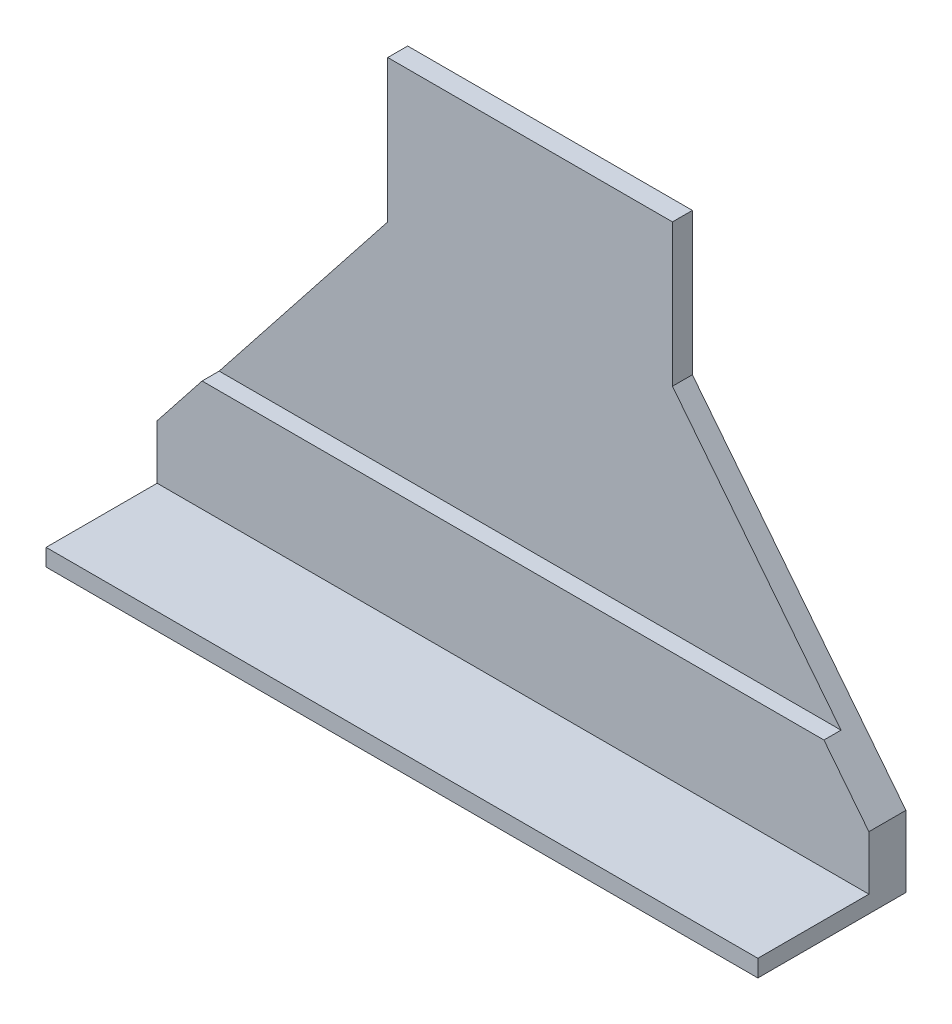
ISO-10303-21;
HEADER;
FILE_DESCRIPTION(('STEP AP214'),'2;1');
FILE_NAME('part.step','',(''),(''),'','','');
FILE_SCHEMA(('AUTOMOTIVE_DESIGN { 1 0 10303 214 1 1 1 1 }'));
ENDSEC;
DATA;
#1=APPLICATION_CONTEXT('core data for automotive mechanical design processes');
#2=APPLICATION_PROTOCOL_DEFINITION('international standard','automotive_design',2000,#1);
#3=PRODUCT_CONTEXT('',#1,'mechanical');
#4=PRODUCT('Part','Part','',(#3));
#5=PRODUCT_RELATED_PRODUCT_CATEGORY('part','',(#4));
#6=PRODUCT_DEFINITION_FORMATION('','',#4);
#7=PRODUCT_DEFINITION_CONTEXT('part definition',#1,'design');
#8=PRODUCT_DEFINITION('design','',#6,#7);
#9=PRODUCT_DEFINITION_SHAPE('','',#8);
#10=(LENGTH_UNIT() NAMED_UNIT(*) SI_UNIT(.MILLI.,.METRE.));
#11=(NAMED_UNIT(*) PLANE_ANGLE_UNIT() SI_UNIT($,.RADIAN.));
#12=(NAMED_UNIT(*) SI_UNIT($,.STERADIAN.) SOLID_ANGLE_UNIT());
#13=UNCERTAINTY_MEASURE_WITH_UNIT(LENGTH_MEASURE(1.E-05),#10,'distance_accuracy_value','');
#14=(GEOMETRIC_REPRESENTATION_CONTEXT(3) GLOBAL_UNCERTAINTY_ASSIGNED_CONTEXT((#13)) GLOBAL_UNIT_ASSIGNED_CONTEXT((#10,
#11,#12)) REPRESENTATION_CONTEXT('',''));
#15=CARTESIAN_POINT('',(0.,0.,0.));
#16=DIRECTION('',(0.,0.,1.));
#17=DIRECTION('',(1.,0.,0.));
#18=AXIS2_PLACEMENT_3D('',#15,#16,#17);
#19=CARTESIAN_POINT('',(-100.,340.,14.));
#20=DIRECTION('',(0.,0.,1.));
#21=DIRECTION('',(1.,0.,0.));
#22=AXIS2_PLACEMENT_3D('',#19,#20,#21);
#23=PLANE('',#22);
#24=DIRECTION('',(-0.619644288579021,-0.784882765533426,0.));
#25=VECTOR('',#24,1.);
#26=CARTESIAN_POINT('',(-100.,240.,14.));
#27=LINE('',#26,#25);
#28=CARTESIAN_POINT('',(-100.,240.,14.));
#29=VERTEX_POINT('',#28);
#30=CARTESIAN_POINT('',(-218.421052631579,90.,14.));
#31=VERTEX_POINT('',#30);
#32=EDGE_CURVE('E197',#29,#31,#27,.T.);
#33=ORIENTED_EDGE('',*,*,#32,.T.);
#34=DIRECTION('',(1.,0.,0.));
#35=VECTOR('',#34,1.);
#36=CARTESIAN_POINT('',(0.,90.,14.));
#37=LINE('',#36,#35);
#38=CARTESIAN_POINT('',(218.421052631579,89.9999999999999,14.));
#39=VERTEX_POINT('',#38);
#40=EDGE_CURVE('E172',#31,#39,#37,.T.);
#41=ORIENTED_EDGE('',*,*,#40,.T.);
#42=DIRECTION('',(-0.619644288579021,0.784882765533426,0.));
#43=VECTOR('',#42,1.);
#44=CARTESIAN_POINT('',(100.,240.,14.));
#45=LINE('',#44,#43);
#46=CARTESIAN_POINT('',(100.,240.,14.));
#47=VERTEX_POINT('',#46);
#48=EDGE_CURVE('E183',#39,#47,#45,.T.);
#49=ORIENTED_EDGE('',*,*,#48,.T.);
#50=DIRECTION('',(0.,1.,0.));
#51=VECTOR('',#50,1.);
#52=CARTESIAN_POINT('',(100.,340.,14.));
#53=LINE('',#52,#51);
#54=CARTESIAN_POINT('',(100.,340.,14.));
#55=VERTEX_POINT('',#54);
#56=EDGE_CURVE('E215',#47,#55,#53,.T.);
#57=ORIENTED_EDGE('',*,*,#56,.T.);
#58=DIRECTION('',(-1.,0.,0.));
#59=VECTOR('',#58,1.);
#60=CARTESIAN_POINT('',(0.,340.,14.));
#61=LINE('',#60,#59);
#62=CARTESIAN_POINT('',(-100.,340.,14.));
#63=VERTEX_POINT('',#62);
#64=EDGE_CURVE('E191',#55,#63,#61,.T.);
#65=ORIENTED_EDGE('',*,*,#64,.T.);
#66=DIRECTION('',(0.,-1.,0.));
#67=VECTOR('',#66,1.);
#68=CARTESIAN_POINT('',(-100.,340.,14.));
#69=LINE('',#68,#67);
#70=EDGE_CURVE('E194',#63,#29,#69,.T.);
#71=ORIENTED_EDGE('',*,*,#70,.T.);
#72=EDGE_LOOP('',(#33,#41,#49,#57,#65,#71));
#73=FACE_BOUND('',#72,.T.);
#74=ADVANCED_FACE('F34',(#73),#23,.T.);
#75=CARTESIAN_POINT('',(-100.,340.,14.));
#76=DIRECTION('',(1.,0.,0.));
#77=DIRECTION('',(0.,1.,0.));
#78=AXIS2_PLACEMENT_3D('',#75,#76,#77);
#79=PLANE('',#78);
#80=DIRECTION('',(0.,-1.,0.));
#81=VECTOR('',#80,1.);
#82=CARTESIAN_POINT('',(-100.,340.,0.));
#83=LINE('',#82,#81);
#84=CARTESIAN_POINT('',(-100.,340.,0.));
#85=VERTEX_POINT('',#84);
#86=CARTESIAN_POINT('',(-100.,240.,0.));
#87=VERTEX_POINT('',#86);
#88=EDGE_CURVE('E228',#85,#87,#83,.T.);
#89=ORIENTED_EDGE('',*,*,#88,.T.);
#90=DIRECTION('',(0.,0.,-1.));
#91=VECTOR('',#90,1.);
#92=CARTESIAN_POINT('',(-100.,240.,14.));
#93=LINE('',#92,#91);
#94=EDGE_CURVE('E43',#29,#87,#93,.T.);
#95=ORIENTED_EDGE('',*,*,#94,.F.);
#96=ORIENTED_EDGE('',*,*,#70,.F.);
#97=DIRECTION('',(0.,0.,-1.));
#98=VECTOR('',#97,1.);
#99=CARTESIAN_POINT('',(-100.,340.,14.));
#100=LINE('',#99,#98);
#101=EDGE_CURVE('E11',#63,#85,#100,.T.);
#102=ORIENTED_EDGE('',*,*,#101,.T.);
#103=EDGE_LOOP('',(#89,#95,#96,#102));
#104=FACE_BOUND('',#103,.T.);
#105=ADVANCED_FACE('F36',(#104),#79,.F.);
#106=CARTESIAN_POINT('',(-100.,240.,14.));
#107=DIRECTION('',(0.784882765533426,-0.619644288579021,0.));
#108=DIRECTION('',(0.619644288579021,0.784882765533426,0.));
#109=AXIS2_PLACEMENT_3D('',#106,#107,#108);
#110=PLANE('',#109);
#111=DIRECTION('',(-0.619644288579021,-0.784882765533426,0.));
#112=VECTOR('',#111,1.);
#113=CARTESIAN_POINT('',(-100.,240.,0.));
#114=LINE('',#113,#112);
#115=CARTESIAN_POINT('',(-250.,50.,0.));
#116=VERTEX_POINT('',#115);
#117=EDGE_CURVE('E226',#87,#116,#114,.T.);
#118=ORIENTED_EDGE('',*,*,#117,.T.);
#119=DIRECTION('',(0.,0.,-1.));
#120=VECTOR('',#119,1.);
#121=CARTESIAN_POINT('',(-250.,50.,14.));
#122=LINE('',#121,#120);
#123=CARTESIAN_POINT('',(-250.,50.,26.));
#124=VERTEX_POINT('',#123);
#125=EDGE_CURVE('E138',#124,#116,#122,.T.);
#126=ORIENTED_EDGE('',*,*,#125,.F.);
#127=DIRECTION('',(-0.619644288579021,-0.784882765533426,0.));
#128=VECTOR('',#127,1.);
#129=CARTESIAN_POINT('',(-178.327645051195,140.784982935154,26.));
#130=LINE('',#129,#128);
#131=CARTESIAN_POINT('',(-218.421052631579,90.,26.));
#132=VERTEX_POINT('',#131);
#133=EDGE_CURVE('E179',#132,#124,#130,.T.);
#134=ORIENTED_EDGE('',*,*,#133,.F.);
#135=DIRECTION('',(0.,0.,-1.));
#136=VECTOR('',#135,1.);
#137=CARTESIAN_POINT('',(-218.421052631579,90.,26.));
#138=LINE('',#137,#136);
#139=EDGE_CURVE('E229',#132,#31,#138,.T.);
#140=ORIENTED_EDGE('',*,*,#139,.T.);
#141=ORIENTED_EDGE('',*,*,#32,.F.);
#142=ORIENTED_EDGE('',*,*,#94,.T.);
#143=EDGE_LOOP('',(#118,#126,#134,#140,#141,#142));
#144=FACE_BOUND('',#143,.T.);
#145=ADVANCED_FACE('F252',(#144),#110,.F.);
#146=CARTESIAN_POINT('',(-250.,0.,14.));
#147=DIRECTION('',(1.,0.,0.));
#148=DIRECTION('',(0.,0.,-1.));
#149=AXIS2_PLACEMENT_3D('',#146,#147,#148);
#150=PLANE('',#149);
#151=DIRECTION('',(0.,-1.,0.));
#152=VECTOR('',#151,1.);
#153=CARTESIAN_POINT('',(-250.,0.,0.));
#154=LINE('',#153,#152);
#155=CARTESIAN_POINT('',(-250.,0.,0.));
#156=VERTEX_POINT('',#155);
#157=EDGE_CURVE('E136',#116,#156,#154,.T.);
#158=ORIENTED_EDGE('',*,*,#157,.T.);
#159=DIRECTION('',(0.,0.,-1.));
#160=VECTOR('',#159,1.);
#161=CARTESIAN_POINT('',(-250.,0.,14.));
#162=LINE('',#161,#160);
#163=CARTESIAN_POINT('',(-250.,0.,104.));
#164=VERTEX_POINT('',#163);
#165=EDGE_CURVE('E128',#164,#156,#162,.T.);
#166=ORIENTED_EDGE('',*,*,#165,.F.);
#167=DIRECTION('',(0.,-1.,0.));
#168=VECTOR('',#167,1.);
#169=CARTESIAN_POINT('',(-250.,0.,104.));
#170=LINE('',#169,#168);
#171=CARTESIAN_POINT('',(-250.,12.,104.));
#172=VERTEX_POINT('',#171);
#173=EDGE_CURVE('E133',#172,#164,#170,.T.);
#174=ORIENTED_EDGE('',*,*,#173,.F.);
#175=DIRECTION('',(0.,0.,-1.));
#176=VECTOR('',#175,1.);
#177=CARTESIAN_POINT('',(-250.,12.,104.));
#178=LINE('',#177,#176);
#179=CARTESIAN_POINT('',(-250.,12.,26.));
#180=VERTEX_POINT('',#179);
#181=EDGE_CURVE('E158',#172,#180,#178,.T.);
#182=ORIENTED_EDGE('',*,*,#181,.T.);
#183=DIRECTION('',(0.,-1.,0.));
#184=VECTOR('',#183,1.);
#185=CARTESIAN_POINT('',(-250.,0.,26.));
#186=LINE('',#185,#184);
#187=EDGE_CURVE('E391',#124,#180,#186,.T.);
#188=ORIENTED_EDGE('',*,*,#187,.F.);
#189=ORIENTED_EDGE('',*,*,#125,.T.);
#190=EDGE_LOOP('',(#158,#166,#174,#182,#188,#189));
#191=FACE_BOUND('',#190,.T.);
#192=ADVANCED_FACE('F130',(#191),#150,.F.);
#193=CARTESIAN_POINT('',(0.,0.,14.));
#194=DIRECTION('',(0.,1.,0.));
#195=DIRECTION('',(0.,0.,1.));
#196=AXIS2_PLACEMENT_3D('',#193,#194,#195);
#197=PLANE('',#196);
#198=DIRECTION('',(1.,0.,0.));
#199=VECTOR('',#198,1.);
#200=CARTESIAN_POINT('',(0.,0.,0.));
#201=LINE('',#200,#199);
#202=CARTESIAN_POINT('',(250.,0.,0.));
#203=VERTEX_POINT('',#202);
#204=EDGE_CURVE('E223',#156,#203,#201,.T.);
#205=ORIENTED_EDGE('',*,*,#204,.T.);
#206=DIRECTION('',(0.,0.,-1.));
#207=VECTOR('',#206,1.);
#208=CARTESIAN_POINT('',(250.,0.,14.));
#209=LINE('',#208,#207);
#210=CARTESIAN_POINT('',(250.,0.,104.));
#211=VERTEX_POINT('',#210);
#212=EDGE_CURVE('E139',#211,#203,#209,.T.);
#213=ORIENTED_EDGE('',*,*,#212,.F.);
#214=DIRECTION('',(1.,0.,0.));
#215=VECTOR('',#214,1.);
#216=CARTESIAN_POINT('',(-250.,0.,104.));
#217=LINE('',#216,#215);
#218=EDGE_CURVE('E142',#164,#211,#217,.T.);
#219=ORIENTED_EDGE('',*,*,#218,.F.);
#220=ORIENTED_EDGE('',*,*,#165,.T.);
#221=EDGE_LOOP('',(#205,#213,#219,#220));
#222=FACE_BOUND('',#221,.T.);
#223=ADVANCED_FACE('F143',(#222),#197,.F.);
#224=CARTESIAN_POINT('',(250.,0.,14.));
#225=DIRECTION('',(-1.,0.,0.));
#226=DIRECTION('',(0.,0.,1.));
#227=AXIS2_PLACEMENT_3D('',#224,#225,#226);
#228=PLANE('',#227);
#229=DIRECTION('',(0.,1.,0.));
#230=VECTOR('',#229,1.);
#231=CARTESIAN_POINT('',(250.,0.,0.));
#232=LINE('',#231,#230);
#233=CARTESIAN_POINT('',(250.,50.,0.));
#234=VERTEX_POINT('',#233);
#235=EDGE_CURVE('E221',#203,#234,#232,.T.);
#236=ORIENTED_EDGE('',*,*,#235,.T.);
#237=DIRECTION('',(0.,0.,-1.));
#238=VECTOR('',#237,1.);
#239=CARTESIAN_POINT('',(250.,50.,14.));
#240=LINE('',#239,#238);
#241=CARTESIAN_POINT('',(250.,49.9999999999999,26.));
#242=VERTEX_POINT('',#241);
#243=EDGE_CURVE('E206',#242,#234,#240,.T.);
#244=ORIENTED_EDGE('',*,*,#243,.F.);
#245=DIRECTION('',(0.,1.,0.));
#246=VECTOR('',#245,1.);
#247=CARTESIAN_POINT('',(250.,0.,26.));
#248=LINE('',#247,#246);
#249=CARTESIAN_POINT('',(250.,12.,26.));
#250=VERTEX_POINT('',#249);
#251=EDGE_CURVE('E165',#250,#242,#248,.T.);
#252=ORIENTED_EDGE('',*,*,#251,.F.);
#253=DIRECTION('',(0.,0.,-1.));
#254=VECTOR('',#253,1.);
#255=CARTESIAN_POINT('',(250.,12.,104.));
#256=LINE('',#255,#254);
#257=CARTESIAN_POINT('',(250.,12.,104.));
#258=VERTEX_POINT('',#257);
#259=EDGE_CURVE('E169',#258,#250,#256,.T.);
#260=ORIENTED_EDGE('',*,*,#259,.F.);
#261=DIRECTION('',(0.,1.,0.));
#262=VECTOR('',#261,1.);
#263=CARTESIAN_POINT('',(250.,0.,104.));
#264=LINE('',#263,#262);
#265=EDGE_CURVE('E147',#211,#258,#264,.T.);
#266=ORIENTED_EDGE('',*,*,#265,.F.);
#267=ORIENTED_EDGE('',*,*,#212,.T.);
#268=EDGE_LOOP('',(#236,#244,#252,#260,#266,#267));
#269=FACE_BOUND('',#268,.T.);
#270=ADVANCED_FACE('F280',(#269),#228,.F.);
#271=CARTESIAN_POINT('',(100.,240.,14.));
#272=DIRECTION('',(-0.784882765533426,-0.619644288579021,0.));
#273=DIRECTION('',(0.619644288579021,-0.784882765533426,0.));
#274=AXIS2_PLACEMENT_3D('',#271,#272,#273);
#275=PLANE('',#274);
#276=DIRECTION('',(-0.619644288579021,0.784882765533426,0.));
#277=VECTOR('',#276,1.);
#278=CARTESIAN_POINT('',(100.,240.,0.));
#279=LINE('',#278,#277);
#280=CARTESIAN_POINT('',(100.,240.,0.));
#281=VERTEX_POINT('',#280);
#282=EDGE_CURVE('E219',#234,#281,#279,.T.);
#283=ORIENTED_EDGE('',*,*,#282,.T.);
#284=DIRECTION('',(0.,0.,-1.));
#285=VECTOR('',#284,1.);
#286=CARTESIAN_POINT('',(100.,240.,14.));
#287=LINE('',#286,#285);
#288=EDGE_CURVE('E209',#47,#281,#287,.T.);
#289=ORIENTED_EDGE('',*,*,#288,.F.);
#290=ORIENTED_EDGE('',*,*,#48,.F.);
#291=DIRECTION('',(0.,0.,-1.));
#292=VECTOR('',#291,1.);
#293=CARTESIAN_POINT('',(218.421052631579,90.,26.));
#294=LINE('',#293,#292);
#295=CARTESIAN_POINT('',(218.421052631579,90.,26.));
#296=VERTEX_POINT('',#295);
#297=EDGE_CURVE('E59',#296,#39,#294,.T.);
#298=ORIENTED_EDGE('',*,*,#297,.F.);
#299=DIRECTION('',(-0.619644288579021,0.784882765533426,0.));
#300=VECTOR('',#299,1.);
#301=CARTESIAN_POINT('',(178.327645051195,140.784982935154,26.));
#302=LINE('',#301,#300);
#303=EDGE_CURVE('E190',#242,#296,#302,.T.);
#304=ORIENTED_EDGE('',*,*,#303,.F.);
#305=ORIENTED_EDGE('',*,*,#243,.T.);
#306=EDGE_LOOP('',(#283,#289,#290,#298,#304,#305));
#307=FACE_BOUND('',#306,.T.);
#308=ADVANCED_FACE('F235',(#307),#275,.F.);
#309=CARTESIAN_POINT('',(100.,340.,14.));
#310=DIRECTION('',(-1.,0.,0.));
#311=DIRECTION('',(0.,0.,1.));
#312=AXIS2_PLACEMENT_3D('',#309,#310,#311);
#313=PLANE('',#312);
#314=DIRECTION('',(0.,1.,0.));
#315=VECTOR('',#314,1.);
#316=CARTESIAN_POINT('',(100.,340.,0.));
#317=LINE('',#316,#315);
#318=CARTESIAN_POINT('',(100.,340.,0.));
#319=VERTEX_POINT('',#318);
#320=EDGE_CURVE('E217',#281,#319,#317,.T.);
#321=ORIENTED_EDGE('',*,*,#320,.T.);
#322=DIRECTION('',(0.,0.,-1.));
#323=VECTOR('',#322,1.);
#324=CARTESIAN_POINT('',(100.,340.,14.));
#325=LINE('',#324,#323);
#326=EDGE_CURVE('E212',#55,#319,#325,.T.);
#327=ORIENTED_EDGE('',*,*,#326,.F.);
#328=ORIENTED_EDGE('',*,*,#56,.F.);
#329=ORIENTED_EDGE('',*,*,#288,.T.);
#330=EDGE_LOOP('',(#321,#327,#328,#329));
#331=FACE_BOUND('',#330,.T.);
#332=ADVANCED_FACE('F239',(#331),#313,.F.);
#333=CARTESIAN_POINT('',(0.,340.,14.));
#334=DIRECTION('',(0.,-1.,0.));
#335=DIRECTION('',(0.,0.,-1.));
#336=AXIS2_PLACEMENT_3D('',#333,#334,#335);
#337=PLANE('',#336);
#338=DIRECTION('',(-1.,0.,0.));
#339=VECTOR('',#338,1.);
#340=CARTESIAN_POINT('',(0.,340.,0.));
#341=LINE('',#340,#339);
#342=EDGE_CURVE('E195',#319,#85,#341,.T.);
#343=ORIENTED_EDGE('',*,*,#342,.T.);
#344=ORIENTED_EDGE('',*,*,#101,.F.);
#345=ORIENTED_EDGE('',*,*,#64,.F.);
#346=ORIENTED_EDGE('',*,*,#326,.T.);
#347=EDGE_LOOP('',(#343,#344,#345,#346));
#348=FACE_BOUND('',#347,.T.);
#349=ADVANCED_FACE('F242',(#348),#337,.F.);
#350=CARTESIAN_POINT('',(-100.,340.,0.));
#351=DIRECTION('',(0.,0.,1.));
#352=DIRECTION('',(1.,0.,0.));
#353=AXIS2_PLACEMENT_3D('',#350,#351,#352);
#354=PLANE('',#353);
#355=ORIENTED_EDGE('',*,*,#88,.F.);
#356=ORIENTED_EDGE('',*,*,#342,.F.);
#357=ORIENTED_EDGE('',*,*,#320,.F.);
#358=ORIENTED_EDGE('',*,*,#282,.F.);
#359=ORIENTED_EDGE('',*,*,#235,.F.);
#360=ORIENTED_EDGE('',*,*,#204,.F.);
#361=ORIENTED_EDGE('',*,*,#157,.F.);
#362=ORIENTED_EDGE('',*,*,#117,.F.);
#363=EDGE_LOOP('',(#355,#356,#357,#358,#359,#360,#361,#362));
#364=FACE_BOUND('',#363,.T.);
#365=ADVANCED_FACE('F246',(#364),#354,.F.);
#366=CARTESIAN_POINT('',(0.,90.,26.));
#367=DIRECTION('',(0.,1.,0.));
#368=DIRECTION('',(0.,0.,1.));
#369=AXIS2_PLACEMENT_3D('',#366,#367,#368);
#370=PLANE('',#369);
#371=ORIENTED_EDGE('',*,*,#40,.F.);
#372=ORIENTED_EDGE('',*,*,#139,.F.);
#373=DIRECTION('',(1.,0.,0.));
#374=VECTOR('',#373,1.);
#375=CARTESIAN_POINT('',(0.,90.,26.));
#376=LINE('',#375,#374);
#377=EDGE_CURVE('E161',#132,#296,#376,.T.);
#378=ORIENTED_EDGE('',*,*,#377,.T.);
#379=ORIENTED_EDGE('',*,*,#297,.T.);
#380=EDGE_LOOP('',(#371,#372,#378,#379));
#381=FACE_BOUND('',#380,.T.);
#382=ADVANCED_FACE('F257',(#381),#370,.T.);
#383=CARTESIAN_POINT('',(0.,0.,26.));
#384=DIRECTION('',(0.,0.,1.));
#385=DIRECTION('',(1.,0.,0.));
#386=AXIS2_PLACEMENT_3D('',#383,#384,#385);
#387=PLANE('',#386);
#388=DIRECTION('',(-1.,0.,0.));
#389=VECTOR('',#388,1.);
#390=CARTESIAN_POINT('',(-250.,12.,26.));
#391=LINE('',#390,#389);
#392=EDGE_CURVE('E51',#250,#180,#391,.T.);
#393=ORIENTED_EDGE('',*,*,#392,.F.);
#394=ORIENTED_EDGE('',*,*,#251,.T.);
#395=ORIENTED_EDGE('',*,*,#303,.T.);
#396=ORIENTED_EDGE('',*,*,#377,.F.);
#397=ORIENTED_EDGE('',*,*,#133,.T.);
#398=ORIENTED_EDGE('',*,*,#187,.T.);
#399=EDGE_LOOP('',(#393,#394,#395,#396,#397,#398));
#400=FACE_BOUND('',#399,.T.);
#401=ADVANCED_FACE('F259',(#400),#387,.T.);
#402=CARTESIAN_POINT('',(-250.,12.,104.));
#403=DIRECTION('',(0.,-1.,0.));
#404=DIRECTION('',(0.,0.,-1.));
#405=AXIS2_PLACEMENT_3D('',#402,#403,#404);
#406=PLANE('',#405);
#407=ORIENTED_EDGE('',*,*,#392,.T.);
#408=ORIENTED_EDGE('',*,*,#181,.F.);
#409=DIRECTION('',(-1.,0.,0.));
#410=VECTOR('',#409,1.);
#411=CARTESIAN_POINT('',(-250.,12.,104.));
#412=LINE('',#411,#410);
#413=EDGE_CURVE('E151',#258,#172,#412,.T.);
#414=ORIENTED_EDGE('',*,*,#413,.F.);
#415=ORIENTED_EDGE('',*,*,#259,.T.);
#416=EDGE_LOOP('',(#407,#408,#414,#415));
#417=FACE_BOUND('',#416,.T.);
#418=ADVANCED_FACE('F265',(#417),#406,.F.);
#419=CARTESIAN_POINT('',(-250.,12.,104.));
#420=DIRECTION('',(0.,0.,-1.));
#421=DIRECTION('',(-1.,0.,0.));
#422=AXIS2_PLACEMENT_3D('',#419,#420,#421);
#423=PLANE('',#422);
#424=ORIENTED_EDGE('',*,*,#173,.T.);
#425=ORIENTED_EDGE('',*,*,#218,.T.);
#426=ORIENTED_EDGE('',*,*,#265,.T.);
#427=ORIENTED_EDGE('',*,*,#413,.T.);
#428=EDGE_LOOP('',(#424,#425,#426,#427));
#429=FACE_BOUND('',#428,.T.);
#430=ADVANCED_FACE('F149',(#429),#423,.F.);
#431=CLOSED_SHELL('',(#74,#105,#145,#192,#223,#270,#308,#332,#349,#365,#382,#401,#418,#430));
#432=MANIFOLD_SOLID_BREP('B2',#431);
#433=ADVANCED_BREP_SHAPE_REPRESENTATION('',(#18,#432),#14);
#434=SHAPE_DEFINITION_REPRESENTATION(#9,#433);
ENDSEC;
END-ISO-10303-21;
